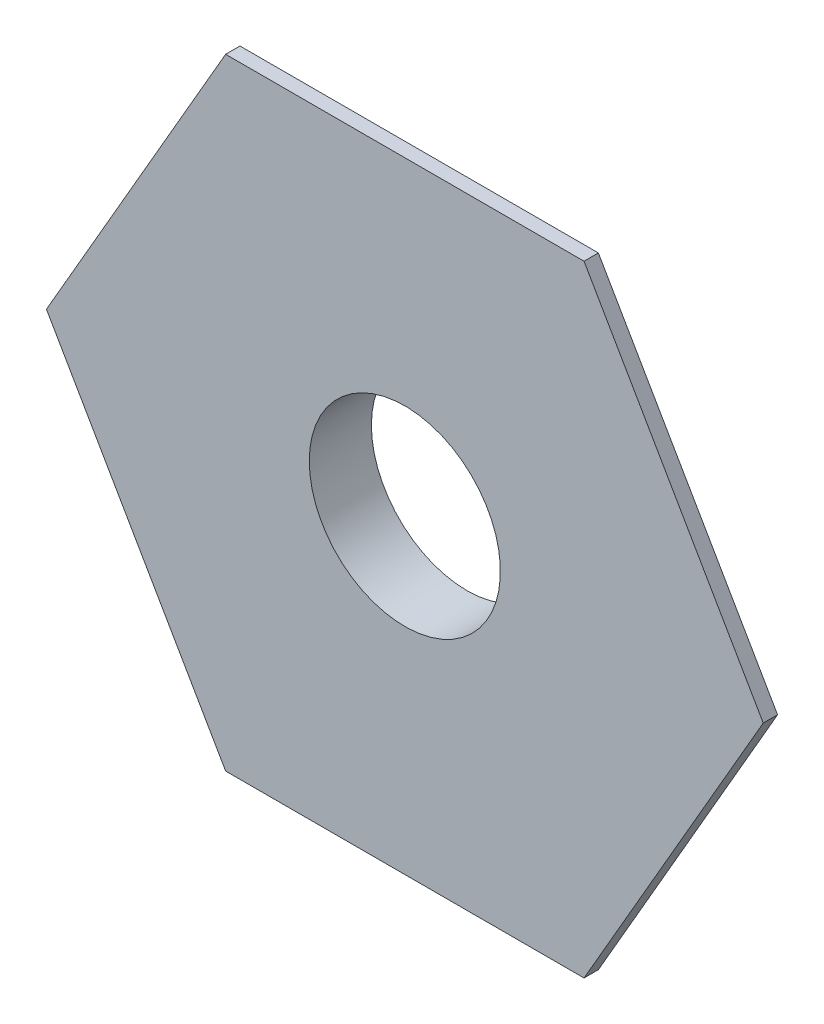
ISO-10303-21;
HEADER;
FILE_DESCRIPTION(('STEP AP214'),'2;1');
FILE_NAME('part.step','',(''),(''),'','','');
FILE_SCHEMA(('AUTOMOTIVE_DESIGN { 1 0 10303 214 1 1 1 1 }'));
ENDSEC;
DATA;
#1=APPLICATION_CONTEXT('core data for automotive mechanical design processes');
#2=APPLICATION_PROTOCOL_DEFINITION('international standard','automotive_design',2000,#1);
#3=PRODUCT_CONTEXT('',#1,'mechanical');
#4=PRODUCT('Part','Part','',(#3));
#5=PRODUCT_RELATED_PRODUCT_CATEGORY('part','',(#4));
#6=PRODUCT_DEFINITION_FORMATION('','',#4);
#7=PRODUCT_DEFINITION_CONTEXT('part definition',#1,'design');
#8=PRODUCT_DEFINITION('design','',#6,#7);
#9=PRODUCT_DEFINITION_SHAPE('','',#8);
#10=(LENGTH_UNIT() NAMED_UNIT(*) SI_UNIT(.MILLI.,.METRE.));
#11=(NAMED_UNIT(*) PLANE_ANGLE_UNIT() SI_UNIT($,.RADIAN.));
#12=(NAMED_UNIT(*) SI_UNIT($,.STERADIAN.) SOLID_ANGLE_UNIT());
#13=UNCERTAINTY_MEASURE_WITH_UNIT(LENGTH_MEASURE(1.E-05),#10,'distance_accuracy_value','');
#14=(GEOMETRIC_REPRESENTATION_CONTEXT(3) GLOBAL_UNCERTAINTY_ASSIGNED_CONTEXT((#13)) GLOBAL_UNIT_ASSIGNED_CONTEXT((#10,
#11,#12)) REPRESENTATION_CONTEXT('',''));
#15=CARTESIAN_POINT('',(0.,0.,0.));
#16=DIRECTION('',(0.,0.,1.));
#17=DIRECTION('',(1.,0.,0.));
#18=AXIS2_PLACEMENT_3D('',#15,#16,#17);
#19=CARTESIAN_POINT('',(0.,0.,8.));
#20=DIRECTION('',(0.,0.,-1.));
#21=DIRECTION('',(-1.,0.,0.));
#22=AXIS2_PLACEMENT_3D('',#19,#20,#21);
#23=CYLINDRICAL_SURFACE('',#22,20.);
#24=CARTESIAN_POINT('',(0.,0.,-7.));
#25=DIRECTION('',(0.,0.,1.));
#26=DIRECTION('',(1.,0.,0.));
#27=AXIS2_PLACEMENT_3D('',#24,#25,#26);
#28=CIRCLE('',#27,20.);
#29=CARTESIAN_POINT('',(20.,0.,-7.));
#30=VERTEX_POINT('',#29);
#31=EDGE_CURVE('E147',#30,#30,#28,.T.);
#32=ORIENTED_EDGE('',*,*,#31,.F.);
#33=EDGE_LOOP('',(#32));
#34=FACE_BOUND('',#33,.T.);
#35=CARTESIAN_POINT('',(0.,0.,6.));
#36=DIRECTION('',(0.,0.,-1.));
#37=DIRECTION('',(-1.,0.,0.));
#38=AXIS2_PLACEMENT_3D('',#35,#36,#37);
#39=CIRCLE('',#38,20.);
#40=CARTESIAN_POINT('',(-20.,0.,6.));
#41=VERTEX_POINT('',#40);
#42=EDGE_CURVE('E130',#41,#41,#39,.T.);
#43=ORIENTED_EDGE('',*,*,#42,.F.);
#44=EDGE_LOOP('',(#43));
#45=FACE_BOUND('',#44,.T.);
#46=ADVANCED_FACE('F38',(#34,#45),#23,.F.);
#47=CARTESIAN_POINT('',(0.,0.,3.));
#48=DIRECTION('',(0.,0.,-1.));
#49=DIRECTION('',(-1.,0.,0.));
#50=AXIS2_PLACEMENT_3D('',#47,#48,#49);
#51=CYLINDRICAL_SURFACE('',#50,37.5);
#52=CARTESIAN_POINT('',(0.,0.,3.));
#53=DIRECTION('',(0.,0.,1.));
#54=DIRECTION('',(1.,0.,0.));
#55=AXIS2_PLACEMENT_3D('',#52,#53,#54);
#56=CIRCLE('',#55,37.5);
#57=CARTESIAN_POINT('',(37.5,0.,3.));
#58=VERTEX_POINT('',#57);
#59=EDGE_CURVE('E11',#58,#58,#56,.T.);
#60=ORIENTED_EDGE('',*,*,#59,.F.);
#61=EDGE_LOOP('',(#60));
#62=FACE_BOUND('',#61,.T.);
#63=CARTESIAN_POINT('',(0.,0.,0.));
#64=DIRECTION('',(0.,0.,1.));
#65=DIRECTION('',(1.,0.,0.));
#66=AXIS2_PLACEMENT_3D('',#63,#64,#65);
#67=CIRCLE('',#66,37.5);
#68=CARTESIAN_POINT('',(37.5,0.,0.));
#69=VERTEX_POINT('',#68);
#70=EDGE_CURVE('E48',#69,#69,#67,.T.);
#71=ORIENTED_EDGE('',*,*,#70,.T.);
#72=EDGE_LOOP('',(#71));
#73=FACE_BOUND('',#72,.T.);
#74=ADVANCED_FACE('F40',(#62,#73),#51,.T.);
#75=CARTESIAN_POINT('',(0.,0.,0.));
#76=DIRECTION('',(0.,0.,1.));
#77=DIRECTION('',(1.,0.,0.));
#78=AXIS2_PLACEMENT_3D('',#75,#76,#77);
#79=PLANE('',#78);
#80=CARTESIAN_POINT('',(-30.,1.04744440165294E-13,0.));
#81=DIRECTION('',(0.,0.,1.));
#82=DIRECTION('',(1.,0.,0.));
#83=AXIS2_PLACEMENT_3D('',#80,#81,#82);
#84=CIRCLE('',#83,1.5);
#85=CARTESIAN_POINT('',(-28.5,1.04744440165294E-13,0.));
#86=VERTEX_POINT('',#85);
#87=EDGE_CURVE('E42',#86,#86,#84,.T.);
#88=ORIENTED_EDGE('',*,*,#87,.T.);
#89=EDGE_LOOP('',(#88));
#90=FACE_BOUND('',#89,.T.);
#91=CARTESIAN_POINT('',(-21.2132034355963,21.2132034355965,0.));
#92=DIRECTION('',(0.,0.,1.));
#93=DIRECTION('',(1.,0.,0.));
#94=AXIS2_PLACEMENT_3D('',#91,#92,#93);
#95=CIRCLE('',#94,1.5);
#96=CARTESIAN_POINT('',(-19.7132034355963,21.2132034355965,0.));
#97=VERTEX_POINT('',#96);
#98=EDGE_CURVE('E198',#97,#97,#95,.T.);
#99=ORIENTED_EDGE('',*,*,#98,.T.);
#100=EDGE_LOOP('',(#99));
#101=FACE_BOUND('',#100,.T.);
#102=CARTESIAN_POINT('',(0.,30.,0.));
#103=DIRECTION('',(0.,0.,1.));
#104=DIRECTION('',(1.,0.,0.));
#105=AXIS2_PLACEMENT_3D('',#102,#103,#104);
#106=CIRCLE('',#105,1.5);
#107=CARTESIAN_POINT('',(1.5,30.,0.));
#108=VERTEX_POINT('',#107);
#109=EDGE_CURVE('E196',#108,#108,#106,.T.);
#110=ORIENTED_EDGE('',*,*,#109,.T.);
#111=EDGE_LOOP('',(#110));
#112=FACE_BOUND('',#111,.T.);
#113=CARTESIAN_POINT('',(21.2132034355966,21.2132034355962,0.));
#114=DIRECTION('',(0.,0.,1.));
#115=DIRECTION('',(1.,0.,0.));
#116=AXIS2_PLACEMENT_3D('',#113,#114,#115);
#117=CIRCLE('',#116,1.5);
#118=CARTESIAN_POINT('',(22.7132034355966,21.2132034355962,0.));
#119=VERTEX_POINT('',#118);
#120=EDGE_CURVE('E193',#119,#119,#117,.T.);
#121=ORIENTED_EDGE('',*,*,#120,.T.);
#122=EDGE_LOOP('',(#121));
#123=FACE_BOUND('',#122,.T.);
#124=CARTESIAN_POINT('',(30.,-3.14233320495882E-13,0.));
#125=DIRECTION('',(0.,0.,1.));
#126=DIRECTION('',(1.,0.,0.));
#127=AXIS2_PLACEMENT_3D('',#124,#125,#126);
#128=CIRCLE('',#127,1.5);
#129=CARTESIAN_POINT('',(31.5,-3.14233320495882E-13,0.));
#130=VERTEX_POINT('',#129);
#131=EDGE_CURVE('E190',#130,#130,#128,.T.);
#132=ORIENTED_EDGE('',*,*,#131,.T.);
#133=EDGE_LOOP('',(#132));
#134=FACE_BOUND('',#133,.T.);
#135=CARTESIAN_POINT('',(21.2132034355962,-21.2132034355967,0.));
#136=DIRECTION('',(0.,0.,1.));
#137=DIRECTION('',(1.,0.,0.));
#138=AXIS2_PLACEMENT_3D('',#135,#136,#137);
#139=CIRCLE('',#138,1.5);
#140=CARTESIAN_POINT('',(22.7132034355962,-21.2132034355967,0.));
#141=VERTEX_POINT('',#140);
#142=EDGE_CURVE('E187',#141,#141,#139,.T.);
#143=ORIENTED_EDGE('',*,*,#142,.T.);
#144=EDGE_LOOP('',(#143));
#145=FACE_BOUND('',#144,.T.);
#146=CARTESIAN_POINT('',(-21.2132034355965,-21.2132034355964,0.));
#147=DIRECTION('',(0.,0.,1.));
#148=DIRECTION('',(1.,0.,0.));
#149=AXIS2_PLACEMENT_3D('',#146,#147,#148);
#150=CIRCLE('',#149,1.5);
#151=CARTESIAN_POINT('',(-19.7132034355965,-21.2132034355964,0.));
#152=VERTEX_POINT('',#151);
#153=EDGE_CURVE('E154',#152,#152,#150,.T.);
#154=ORIENTED_EDGE('',*,*,#153,.T.);
#155=EDGE_LOOP('',(#154));
#156=FACE_BOUND('',#155,.T.);
#157=CARTESIAN_POINT('',(0.,-30.,0.));
#158=DIRECTION('',(0.,0.,1.));
#159=DIRECTION('',(1.,0.,0.));
#160=AXIS2_PLACEMENT_3D('',#157,#158,#159);
#161=CIRCLE('',#160,1.5);
#162=CARTESIAN_POINT('',(1.5,-30.,0.));
#163=VERTEX_POINT('',#162);
#164=EDGE_CURVE('E179',#163,#163,#161,.T.);
#165=ORIENTED_EDGE('',*,*,#164,.T.);
#166=EDGE_LOOP('',(#165));
#167=FACE_BOUND('',#166,.T.);
#168=CARTESIAN_POINT('',(0.,0.,0.));
#169=DIRECTION('',(0.,0.,-1.));
#170=DIRECTION('',(-1.,0.,0.));
#171=AXIS2_PLACEMENT_3D('',#168,#169,#170);
#172=CIRCLE('',#171,25.);
#173=CARTESIAN_POINT('',(-25.,0.,0.));
#174=VERTEX_POINT('',#173);
#175=EDGE_CURVE('E177',#174,#174,#172,.T.);
#176=ORIENTED_EDGE('',*,*,#175,.F.);
#177=EDGE_LOOP('',(#176));
#178=FACE_BOUND('',#177,.T.);
#179=ORIENTED_EDGE('',*,*,#70,.F.);
#180=EDGE_LOOP('',(#179));
#181=FACE_BOUND('',#180,.T.);
#182=ADVANCED_FACE('F205',(#90,#101,#112,#123,#134,#145,#156,#167,#178,#181),#79,.F.);
#183=CARTESIAN_POINT('',(0.,-30.,-10.));
#184=DIRECTION('',(0.,0.,1.));
#185=DIRECTION('',(1.,0.,0.));
#186=AXIS2_PLACEMENT_3D('',#183,#184,#185);
#187=CYLINDRICAL_SURFACE('',#186,1.5);
#188=CARTESIAN_POINT('',(0.,-30.,3.));
#189=DIRECTION('',(0.,0.,1.));
#190=DIRECTION('',(1.,0.,0.));
#191=AXIS2_PLACEMENT_3D('',#188,#189,#190);
#192=CIRCLE('',#191,1.5);
#193=CARTESIAN_POINT('',(1.5,-30.,3.));
#194=VERTEX_POINT('',#193);
#195=EDGE_CURVE('E146',#194,#194,#192,.T.);
#196=ORIENTED_EDGE('',*,*,#195,.T.);
#197=EDGE_LOOP('',(#196));
#198=FACE_BOUND('',#197,.T.);
#199=ORIENTED_EDGE('',*,*,#164,.F.);
#200=EDGE_LOOP('',(#199));
#201=FACE_BOUND('',#200,.T.);
#202=ADVANCED_FACE('F247',(#198,#201),#187,.F.);
#203=CARTESIAN_POINT('',(-21.2132034355965,-21.2132034355964,-10.));
#204=DIRECTION('',(0.,0.,1.));
#205=DIRECTION('',(1.,0.,0.));
#206=AXIS2_PLACEMENT_3D('',#203,#204,#205);
#207=CYLINDRICAL_SURFACE('',#206,1.5);
#208=CARTESIAN_POINT('',(-21.2132034355965,-21.2132034355964,3.));
#209=DIRECTION('',(0.,0.,1.));
#210=DIRECTION('',(0.707106781186546,-0.707106781186549,0.));
#211=AXIS2_PLACEMENT_3D('',#208,#209,#210);
#212=CIRCLE('',#211,1.5);
#213=CARTESIAN_POINT('',(-20.1525432638166,-22.2738636073762,3.));
#214=VERTEX_POINT('',#213);
#215=EDGE_CURVE('E162',#214,#214,#212,.T.);
#216=ORIENTED_EDGE('',*,*,#215,.T.);
#217=EDGE_LOOP('',(#216));
#218=FACE_BOUND('',#217,.T.);
#219=ORIENTED_EDGE('',*,*,#153,.F.);
#220=EDGE_LOOP('',(#219));
#221=FACE_BOUND('',#220,.T.);
#222=ADVANCED_FACE('F242',(#218,#221),#207,.F.);
#223=CARTESIAN_POINT('',(21.2132034355962,-21.2132034355967,-10.));
#224=DIRECTION('',(0.,0.,1.));
#225=DIRECTION('',(1.,0.,0.));
#226=AXIS2_PLACEMENT_3D('',#223,#224,#225);
#227=CYLINDRICAL_SURFACE('',#226,1.5);
#228=CARTESIAN_POINT('',(21.2132034355962,-21.2132034355967,3.));
#229=DIRECTION('',(0.,0.,1.));
#230=DIRECTION('',(0.707106781186556,0.707106781186539,0.));
#231=AXIS2_PLACEMENT_3D('',#228,#229,#230);
#232=CIRCLE('',#231,1.5);
#233=CARTESIAN_POINT('',(22.273863607376,-20.1525432638169,3.));
#234=VERTEX_POINT('',#233);
#235=EDGE_CURVE('E159',#234,#234,#232,.T.);
#236=ORIENTED_EDGE('',*,*,#235,.T.);
#237=EDGE_LOOP('',(#236));
#238=FACE_BOUND('',#237,.T.);
#239=ORIENTED_EDGE('',*,*,#142,.F.);
#240=EDGE_LOOP('',(#239));
#241=FACE_BOUND('',#240,.T.);
#242=ADVANCED_FACE('F239',(#238,#241),#227,.F.);
#243=CARTESIAN_POINT('',(30.,-3.14233320495882E-13,-10.));
#244=DIRECTION('',(0.,0.,1.));
#245=DIRECTION('',(1.,0.,0.));
#246=AXIS2_PLACEMENT_3D('',#243,#244,#245);
#247=CYLINDRICAL_SURFACE('',#246,1.5);
#248=CARTESIAN_POINT('',(30.,-3.14233320495882E-13,3.));
#249=DIRECTION('',(0.,0.,1.));
#250=DIRECTION('',(0.,1.,0.));
#251=AXIS2_PLACEMENT_3D('',#248,#249,#250);
#252=CIRCLE('',#251,1.5);
#253=CARTESIAN_POINT('',(30.,1.49999999999969,3.));
#254=VERTEX_POINT('',#253);
#255=EDGE_CURVE('E155',#254,#254,#252,.T.);
#256=ORIENTED_EDGE('',*,*,#255,.T.);
#257=EDGE_LOOP('',(#256));
#258=FACE_BOUND('',#257,.T.);
#259=ORIENTED_EDGE('',*,*,#131,.F.);
#260=EDGE_LOOP('',(#259));
#261=FACE_BOUND('',#260,.T.);
#262=ADVANCED_FACE('F236',(#258,#261),#247,.F.);
#263=CARTESIAN_POINT('',(21.2132034355966,21.2132034355962,-10.));
#264=DIRECTION('',(0.,0.,1.));
#265=DIRECTION('',(1.,0.,0.));
#266=AXIS2_PLACEMENT_3D('',#263,#264,#265);
#267=CYLINDRICAL_SURFACE('',#266,1.5);
#268=CARTESIAN_POINT('',(21.2132034355966,21.2132034355962,3.));
#269=DIRECTION('',(0.,0.,1.));
#270=DIRECTION('',(-0.707106781186541,0.707106781186554,0.));
#271=AXIS2_PLACEMENT_3D('',#268,#269,#270);
#272=CIRCLE('',#271,1.5);
#273=CARTESIAN_POINT('',(20.1525432638168,22.2738636073761,3.));
#274=VERTEX_POINT('',#273);
#275=EDGE_CURVE('E158',#274,#274,#272,.T.);
#276=ORIENTED_EDGE('',*,*,#275,.T.);
#277=EDGE_LOOP('',(#276));
#278=FACE_BOUND('',#277,.T.);
#279=ORIENTED_EDGE('',*,*,#120,.F.);
#280=EDGE_LOOP('',(#279));
#281=FACE_BOUND('',#280,.T.);
#282=ADVANCED_FACE('F238',(#278,#281),#267,.F.);
#283=CARTESIAN_POINT('',(0.,30.,-10.));
#284=DIRECTION('',(0.,0.,1.));
#285=DIRECTION('',(1.,0.,0.));
#286=AXIS2_PLACEMENT_3D('',#283,#284,#285);
#287=CYLINDRICAL_SURFACE('',#286,1.5);
#288=CARTESIAN_POINT('',(0.,30.,3.));
#289=DIRECTION('',(0.,0.,1.));
#290=DIRECTION('',(-1.,0.,0.));
#291=AXIS2_PLACEMENT_3D('',#288,#289,#290);
#292=CIRCLE('',#291,1.5);
#293=CARTESIAN_POINT('',(-1.5,30.,3.));
#294=VERTEX_POINT('',#293);
#295=EDGE_CURVE('E168',#294,#294,#292,.T.);
#296=ORIENTED_EDGE('',*,*,#295,.T.);
#297=EDGE_LOOP('',(#296));
#298=FACE_BOUND('',#297,.T.);
#299=ORIENTED_EDGE('',*,*,#109,.F.);
#300=EDGE_LOOP('',(#299));
#301=FACE_BOUND('',#300,.T.);
#302=ADVANCED_FACE('F220',(#298,#301),#287,.F.);
#303=CARTESIAN_POINT('',(-21.2132034355963,21.2132034355965,-10.));
#304=DIRECTION('',(0.,0.,1.));
#305=DIRECTION('',(1.,0.,0.));
#306=AXIS2_PLACEMENT_3D('',#303,#304,#305);
#307=CYLINDRICAL_SURFACE('',#306,1.5);
#308=CARTESIAN_POINT('',(-21.2132034355963,21.2132034355965,3.));
#309=DIRECTION('',(0.,0.,1.));
#310=DIRECTION('',(-0.707106781186551,-0.707106781186544,0.));
#311=AXIS2_PLACEMENT_3D('',#308,#309,#310);
#312=CIRCLE('',#311,1.5);
#313=CARTESIAN_POINT('',(-22.2738636073761,20.1525432638167,3.));
#314=VERTEX_POINT('',#313);
#315=EDGE_CURVE('E165',#314,#314,#312,.T.);
#316=ORIENTED_EDGE('',*,*,#315,.T.);
#317=EDGE_LOOP('',(#316));
#318=FACE_BOUND('',#317,.T.);
#319=ORIENTED_EDGE('',*,*,#98,.F.);
#320=EDGE_LOOP('',(#319));
#321=FACE_BOUND('',#320,.T.);
#322=ADVANCED_FACE('F210',(#318,#321),#307,.F.);
#323=CARTESIAN_POINT('',(-30.,1.04744440165294E-13,-10.));
#324=DIRECTION('',(0.,0.,1.));
#325=DIRECTION('',(1.,0.,0.));
#326=AXIS2_PLACEMENT_3D('',#323,#324,#325);
#327=CYLINDRICAL_SURFACE('',#326,1.5);
#328=CARTESIAN_POINT('',(-30.,1.04744440165294E-13,3.));
#329=DIRECTION('',(0.,0.,1.));
#330=DIRECTION('',(0.,-1.,0.));
#331=AXIS2_PLACEMENT_3D('',#328,#329,#330);
#332=CIRCLE('',#331,1.5);
#333=CARTESIAN_POINT('',(-30.,-1.4999999999999,3.));
#334=VERTEX_POINT('',#333);
#335=EDGE_CURVE('E151',#334,#334,#332,.T.);
#336=ORIENTED_EDGE('',*,*,#335,.T.);
#337=EDGE_LOOP('',(#336));
#338=FACE_BOUND('',#337,.T.);
#339=ORIENTED_EDGE('',*,*,#87,.F.);
#340=EDGE_LOOP('',(#339));
#341=FACE_BOUND('',#340,.T.);
#342=ADVANCED_FACE('F207',(#338,#341),#327,.F.);
#343=CARTESIAN_POINT('',(0.,0.,8.));
#344=DIRECTION('',(0.,0.,-1.));
#345=DIRECTION('',(-1.,0.,0.));
#346=AXIS2_PLACEMENT_3D('',#343,#344,#345);
#347=CYLINDRICAL_SURFACE('',#346,25.);
#348=CARTESIAN_POINT('',(0.,0.,-7.));
#349=DIRECTION('',(0.,0.,1.));
#350=DIRECTION('',(1.,0.,0.));
#351=AXIS2_PLACEMENT_3D('',#348,#349,#350);
#352=CIRCLE('',#351,25.);
#353=CARTESIAN_POINT('',(25.,0.,-7.));
#354=VERTEX_POINT('',#353);
#355=EDGE_CURVE('E150',#354,#354,#352,.T.);
#356=ORIENTED_EDGE('',*,*,#355,.T.);
#357=EDGE_LOOP('',(#356));
#358=FACE_BOUND('',#357,.T.);
#359=ORIENTED_EDGE('',*,*,#175,.T.);
#360=EDGE_LOOP('',(#359));
#361=FACE_BOUND('',#360,.T.);
#362=ADVANCED_FACE('F209',(#358,#361),#347,.T.);
#363=CARTESIAN_POINT('',(0.,0.,-7.));
#364=DIRECTION('',(0.,0.,1.));
#365=DIRECTION('',(1.,0.,0.));
#366=AXIS2_PLACEMENT_3D('',#363,#364,#365);
#367=PLANE('',#366);
#368=ORIENTED_EDGE('',*,*,#31,.T.);
#369=EDGE_LOOP('',(#368));
#370=FACE_BOUND('',#369,.T.);
#371=ORIENTED_EDGE('',*,*,#355,.F.);
#372=EDGE_LOOP('',(#371));
#373=FACE_BOUND('',#372,.T.);
#374=ADVANCED_FACE('F217',(#370,#373),#367,.F.);
#375=CARTESIAN_POINT('',(0.,0.,3.));
#376=DIRECTION('',(0.,0.,1.));
#377=DIRECTION('',(1.,0.,0.));
#378=AXIS2_PLACEMENT_3D('',#375,#376,#377);
#379=PLANE('',#378);
#380=ORIENTED_EDGE('',*,*,#59,.T.);
#381=EDGE_LOOP('',(#380));
#382=FACE_BOUND('',#381,.T.);
#383=DIRECTION('',(-0.5,0.866025403784439,0.));
#384=VECTOR('',#383,1.);
#385=CARTESIAN_POINT('',(75.,0.,3.));
#386=LINE('',#385,#384);
#387=CARTESIAN_POINT('',(75.,0.,3.));
#388=VERTEX_POINT('',#387);
#389=CARTESIAN_POINT('',(37.5,64.9519052838328,3.));
#390=VERTEX_POINT('',#389);
#391=EDGE_CURVE('E126',#388,#390,#386,.T.);
#392=ORIENTED_EDGE('',*,*,#391,.F.);
#393=DIRECTION('',(0.5,0.866025403784439,0.));
#394=VECTOR('',#393,1.);
#395=CARTESIAN_POINT('',(37.5,-64.9519052838329,3.));
#396=LINE('',#395,#394);
#397=CARTESIAN_POINT('',(37.5,-64.9519052838329,3.));
#398=VERTEX_POINT('',#397);
#399=EDGE_CURVE('E86',#398,#388,#396,.T.);
#400=ORIENTED_EDGE('',*,*,#399,.F.);
#401=DIRECTION('',(1.,0.,0.));
#402=VECTOR('',#401,1.);
#403=CARTESIAN_POINT('',(-37.4999999999999,-64.9519052838329,3.));
#404=LINE('',#403,#402);
#405=CARTESIAN_POINT('',(-37.4999999999999,-64.9519052838329,3.));
#406=VERTEX_POINT('',#405);
#407=EDGE_CURVE('E80',#406,#398,#404,.T.);
#408=ORIENTED_EDGE('',*,*,#407,.F.);
#409=DIRECTION('',(0.5,-0.866025403784439,0.));
#410=VECTOR('',#409,1.);
#411=CARTESIAN_POINT('',(-74.9999999999999,0.,3.));
#412=LINE('',#411,#410);
#413=CARTESIAN_POINT('',(-74.9999999999999,0.,3.));
#414=VERTEX_POINT('',#413);
#415=EDGE_CURVE('E116',#414,#406,#412,.T.);
#416=ORIENTED_EDGE('',*,*,#415,.F.);
#417=DIRECTION('',(-0.499999999999999,-0.866025403784439,0.));
#418=VECTOR('',#417,1.);
#419=CARTESIAN_POINT('',(-37.5,64.9519052838329,3.));
#420=LINE('',#419,#418);
#421=CARTESIAN_POINT('',(-37.5,64.9519052838329,3.));
#422=VERTEX_POINT('',#421);
#423=EDGE_CURVE('E132',#422,#414,#420,.T.);
#424=ORIENTED_EDGE('',*,*,#423,.F.);
#425=DIRECTION('',(-1.,0.,0.));
#426=VECTOR('',#425,1.);
#427=CARTESIAN_POINT('',(37.5,64.9519052838328,3.));
#428=LINE('',#427,#426);
#429=EDGE_CURVE('E129',#390,#422,#428,.T.);
#430=ORIENTED_EDGE('',*,*,#429,.F.);
#431=EDGE_LOOP('',(#392,#400,#408,#416,#424,#430));
#432=FACE_BOUND('',#431,.T.);
#433=ADVANCED_FACE('F303',(#382,#432),#379,.F.);
#434=CARTESIAN_POINT('',(0.,0.,6.));
#435=DIRECTION('',(0.,0.,1.));
#436=DIRECTION('',(1.,0.,0.));
#437=AXIS2_PLACEMENT_3D('',#434,#435,#436);
#438=PLANE('',#437);
#439=ORIENTED_EDGE('',*,*,#42,.T.);
#440=EDGE_LOOP('',(#439));
#441=FACE_BOUND('',#440,.T.);
#442=DIRECTION('',(-0.5,0.866025403784439,0.));
#443=VECTOR('',#442,1.);
#444=CARTESIAN_POINT('',(75.,0.,6.));
#445=LINE('',#444,#443);
#446=CARTESIAN_POINT('',(75.,0.,6.));
#447=VERTEX_POINT('',#446);
#448=CARTESIAN_POINT('',(37.5,64.9519052838328,6.));
#449=VERTEX_POINT('',#448);
#450=EDGE_CURVE('E137',#447,#449,#445,.T.);
#451=ORIENTED_EDGE('',*,*,#450,.T.);
#452=DIRECTION('',(-1.,0.,0.));
#453=VECTOR('',#452,1.);
#454=CARTESIAN_POINT('',(37.5,64.9519052838328,6.));
#455=LINE('',#454,#453);
#456=CARTESIAN_POINT('',(-37.5,64.9519052838329,6.));
#457=VERTEX_POINT('',#456);
#458=EDGE_CURVE('E95',#449,#457,#455,.T.);
#459=ORIENTED_EDGE('',*,*,#458,.T.);
#460=DIRECTION('',(-0.499999999999999,-0.866025403784439,0.));
#461=VECTOR('',#460,1.);
#462=CARTESIAN_POINT('',(-37.5,64.9519052838329,6.));
#463=LINE('',#462,#461);
#464=CARTESIAN_POINT('',(-74.9999999999999,0.,6.));
#465=VERTEX_POINT('',#464);
#466=EDGE_CURVE('E108',#457,#465,#463,.T.);
#467=ORIENTED_EDGE('',*,*,#466,.T.);
#468=DIRECTION('',(0.5,-0.866025403784439,0.));
#469=VECTOR('',#468,1.);
#470=CARTESIAN_POINT('',(-74.9999999999999,0.,6.));
#471=LINE('',#470,#469);
#472=CARTESIAN_POINT('',(-37.4999999999999,-64.9519052838329,6.));
#473=VERTEX_POINT('',#472);
#474=EDGE_CURVE('E102',#465,#473,#471,.T.);
#475=ORIENTED_EDGE('',*,*,#474,.T.);
#476=DIRECTION('',(1.,0.,0.));
#477=VECTOR('',#476,1.);
#478=CARTESIAN_POINT('',(-37.4999999999999,-64.9519052838329,6.));
#479=LINE('',#478,#477);
#480=CARTESIAN_POINT('',(37.5,-64.9519052838329,6.));
#481=VERTEX_POINT('',#480);
#482=EDGE_CURVE('E106',#473,#481,#479,.T.);
#483=ORIENTED_EDGE('',*,*,#482,.T.);
#484=DIRECTION('',(0.5,0.866025403784439,0.));
#485=VECTOR('',#484,1.);
#486=CARTESIAN_POINT('',(37.5,-64.9519052838329,6.));
#487=LINE('',#486,#485);
#488=EDGE_CURVE('E57',#481,#447,#487,.T.);
#489=ORIENTED_EDGE('',*,*,#488,.T.);
#490=EDGE_LOOP('',(#451,#459,#467,#475,#483,#489));
#491=FACE_BOUND('',#490,.T.);
#492=ADVANCED_FACE('F104',(#441,#491),#438,.T.);
#493=CARTESIAN_POINT('',(37.5,-64.9519052838329,6.));
#494=DIRECTION('',(-0.866025403784439,0.5,0.));
#495=DIRECTION('',(-0.5,-0.866025403784439,0.));
#496=AXIS2_PLACEMENT_3D('',#493,#494,#495);
#497=PLANE('',#496);
#498=ORIENTED_EDGE('',*,*,#399,.T.);
#499=DIRECTION('',(0.,0.,-1.));
#500=VECTOR('',#499,1.);
#501=CARTESIAN_POINT('',(75.,0.,6.));
#502=LINE('',#501,#500);
#503=EDGE_CURVE('E122',#447,#388,#502,.T.);
#504=ORIENTED_EDGE('',*,*,#503,.F.);
#505=ORIENTED_EDGE('',*,*,#488,.F.);
#506=DIRECTION('',(0.,0.,-1.));
#507=VECTOR('',#506,1.);
#508=CARTESIAN_POINT('',(37.5,-64.9519052838329,6.));
#509=LINE('',#508,#507);
#510=EDGE_CURVE('E118',#481,#398,#509,.T.);
#511=ORIENTED_EDGE('',*,*,#510,.T.);
#512=EDGE_LOOP('',(#498,#504,#505,#511));
#513=FACE_BOUND('',#512,.T.);
#514=ADVANCED_FACE('F309',(#513),#497,.F.);
#515=CARTESIAN_POINT('',(-37.4999999999999,-64.9519052838329,6.));
#516=DIRECTION('',(0.,1.,0.));
#517=DIRECTION('',(0.,0.,1.));
#518=AXIS2_PLACEMENT_3D('',#515,#516,#517);
#519=PLANE('',#518);
#520=ORIENTED_EDGE('',*,*,#407,.T.);
#521=ORIENTED_EDGE('',*,*,#510,.F.);
#522=ORIENTED_EDGE('',*,*,#482,.F.);
#523=DIRECTION('',(0.,0.,-1.));
#524=VECTOR('',#523,1.);
#525=CARTESIAN_POINT('',(-37.4999999999999,-64.9519052838329,6.));
#526=LINE('',#525,#524);
#527=EDGE_CURVE('E113',#473,#406,#526,.T.);
#528=ORIENTED_EDGE('',*,*,#527,.T.);
#529=EDGE_LOOP('',(#520,#521,#522,#528));
#530=FACE_BOUND('',#529,.T.);
#531=ADVANCED_FACE('F120',(#530),#519,.F.);
#532=CARTESIAN_POINT('',(-74.9999999999999,0.,6.));
#533=DIRECTION('',(0.866025403784438,0.5,0.));
#534=DIRECTION('',(-0.5,0.866025403784439,0.));
#535=AXIS2_PLACEMENT_3D('',#532,#533,#534);
#536=PLANE('',#535);
#537=ORIENTED_EDGE('',*,*,#415,.T.);
#538=ORIENTED_EDGE('',*,*,#527,.F.);
#539=ORIENTED_EDGE('',*,*,#474,.F.);
#540=DIRECTION('',(0.,0.,-1.));
#541=VECTOR('',#540,1.);
#542=CARTESIAN_POINT('',(-74.9999999999999,0.,6.));
#543=LINE('',#542,#541);
#544=EDGE_CURVE('E117',#465,#414,#543,.T.);
#545=ORIENTED_EDGE('',*,*,#544,.T.);
#546=EDGE_LOOP('',(#537,#538,#539,#545));
#547=FACE_BOUND('',#546,.T.);
#548=ADVANCED_FACE('F114',(#547),#536,.F.);
#549=CARTESIAN_POINT('',(-37.5,64.9519052838329,6.));
#550=DIRECTION('',(0.866025403784439,-0.499999999999999,0.));
#551=DIRECTION('',(0.499999999999999,0.866025403784439,0.));
#552=AXIS2_PLACEMENT_3D('',#549,#550,#551);
#553=PLANE('',#552);
#554=ORIENTED_EDGE('',*,*,#423,.T.);
#555=ORIENTED_EDGE('',*,*,#544,.F.);
#556=ORIENTED_EDGE('',*,*,#466,.F.);
#557=DIRECTION('',(0.,0.,-1.));
#558=VECTOR('',#557,1.);
#559=CARTESIAN_POINT('',(-37.5,64.9519052838329,6.));
#560=LINE('',#559,#558);
#561=EDGE_CURVE('E141',#457,#422,#560,.T.);
#562=ORIENTED_EDGE('',*,*,#561,.T.);
#563=EDGE_LOOP('',(#554,#555,#556,#562));
#564=FACE_BOUND('',#563,.T.);
#565=ADVANCED_FACE('F316',(#564),#553,.F.);
#566=CARTESIAN_POINT('',(37.5,64.9519052838328,6.));
#567=DIRECTION('',(0.,-1.,0.));
#568=DIRECTION('',(1.,0.,0.));
#569=AXIS2_PLACEMENT_3D('',#566,#567,#568);
#570=PLANE('',#569);
#571=ORIENTED_EDGE('',*,*,#429,.T.);
#572=ORIENTED_EDGE('',*,*,#561,.F.);
#573=ORIENTED_EDGE('',*,*,#458,.F.);
#574=DIRECTION('',(0.,0.,-1.));
#575=VECTOR('',#574,1.);
#576=CARTESIAN_POINT('',(37.5,64.9519052838328,6.));
#577=LINE('',#576,#575);
#578=EDGE_CURVE('E144',#449,#390,#577,.T.);
#579=ORIENTED_EDGE('',*,*,#578,.T.);
#580=EDGE_LOOP('',(#571,#572,#573,#579));
#581=FACE_BOUND('',#580,.T.);
#582=ADVANCED_FACE('F319',(#581),#570,.F.);
#583=CARTESIAN_POINT('',(75.,0.,6.));
#584=DIRECTION('',(-0.866025403784439,-0.5,0.));
#585=DIRECTION('',(0.5,-0.866025403784439,0.));
#586=AXIS2_PLACEMENT_3D('',#583,#584,#585);
#587=PLANE('',#586);
#588=ORIENTED_EDGE('',*,*,#391,.T.);
#589=ORIENTED_EDGE('',*,*,#578,.F.);
#590=ORIENTED_EDGE('',*,*,#450,.F.);
#591=ORIENTED_EDGE('',*,*,#503,.T.);
#592=EDGE_LOOP('',(#588,#589,#590,#591));
#593=FACE_BOUND('',#592,.T.);
#594=ADVANCED_FACE('F322',(#593),#587,.F.);
#595=ORIENTED_EDGE('',*,*,#195,.F.);
#596=EDGE_LOOP('',(#595));
#597=FACE_BOUND('',#596,.T.);
#598=ADVANCED_FACE('F308',(#597),#379,.F.);
#599=ORIENTED_EDGE('',*,*,#215,.F.);
#600=EDGE_LOOP('',(#599));
#601=FACE_BOUND('',#600,.T.);
#602=ADVANCED_FACE('F328',(#601),#379,.F.);
#603=ORIENTED_EDGE('',*,*,#235,.F.);
#604=EDGE_LOOP('',(#603));
#605=FACE_BOUND('',#604,.T.);
#606=ADVANCED_FACE('F389',(#605),#379,.F.);
#607=ORIENTED_EDGE('',*,*,#255,.F.);
#608=EDGE_LOOP('',(#607));
#609=FACE_BOUND('',#608,.T.);
#610=ADVANCED_FACE('F301',(#609),#379,.F.);
#611=ORIENTED_EDGE('',*,*,#275,.F.);
#612=EDGE_LOOP('',(#611));
#613=FACE_BOUND('',#612,.T.);
#614=ADVANCED_FACE('F293',(#613),#379,.F.);
#615=ORIENTED_EDGE('',*,*,#295,.F.);
#616=EDGE_LOOP('',(#615));
#617=FACE_BOUND('',#616,.T.);
#618=ADVANCED_FACE('F290',(#617),#379,.F.);
#619=ORIENTED_EDGE('',*,*,#315,.F.);
#620=EDGE_LOOP('',(#619));
#621=FACE_BOUND('',#620,.T.);
#622=ADVANCED_FACE('F292',(#621),#379,.F.);
#623=ORIENTED_EDGE('',*,*,#335,.F.);
#624=EDGE_LOOP('',(#623));
#625=FACE_BOUND('',#624,.T.);
#626=ADVANCED_FACE('F299',(#625),#379,.F.);
#627=CLOSED_SHELL('',(#46,#74,#182,#202,#222,#242,#262,#282,#302,#322,#342,#362,#374,#433,#492,
#514,#531,#548,#565,#582,#594,#598,#602,#606,#610,#614,#618,#622,#626));
#628=MANIFOLD_SOLID_BREP('B2',#627);
#629=ADVANCED_BREP_SHAPE_REPRESENTATION('',(#18,#628),#14);
#630=SHAPE_DEFINITION_REPRESENTATION(#9,#629);
ENDSEC;
END-ISO-10303-21;
